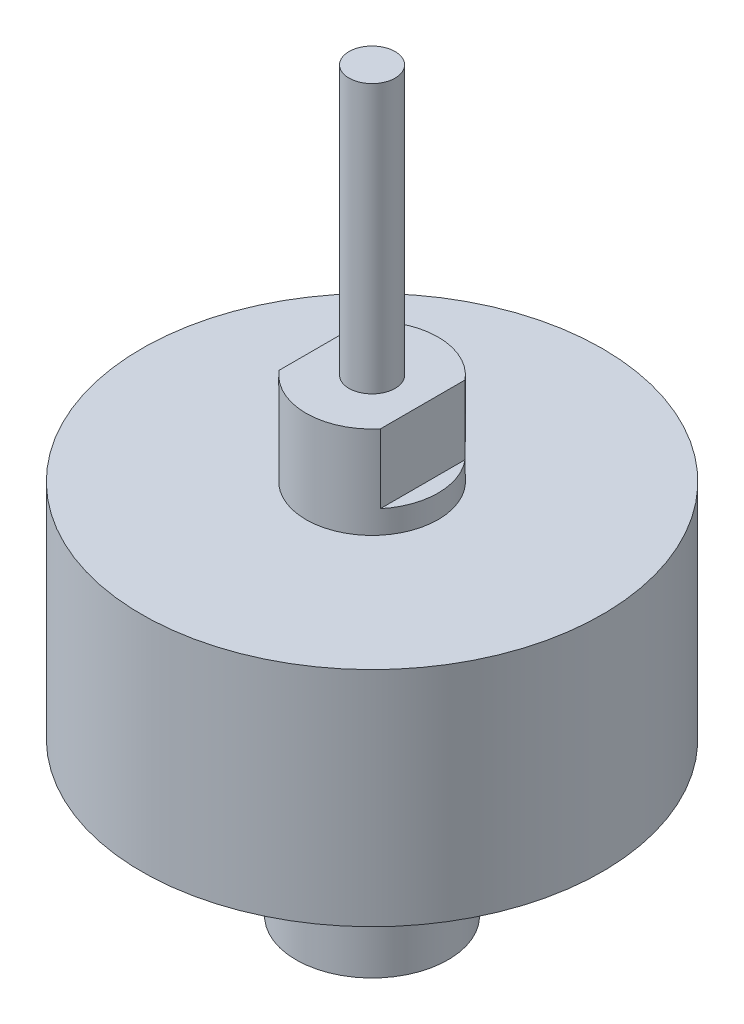
ISO-10303-21;
HEADER;
FILE_DESCRIPTION(('STEP AP214'),'2;1');
FILE_NAME('part.step','',(''),(''),'','','');
FILE_SCHEMA(('AUTOMOTIVE_DESIGN { 1 0 10303 214 1 1 1 1 }'));
ENDSEC;
DATA;
#1=APPLICATION_CONTEXT('core data for automotive mechanical design processes');
#2=APPLICATION_PROTOCOL_DEFINITION('international standard','automotive_design',2000,#1);
#3=PRODUCT_CONTEXT('',#1,'mechanical');
#4=PRODUCT('Part','Part','',(#3));
#5=PRODUCT_RELATED_PRODUCT_CATEGORY('part','',(#4));
#6=PRODUCT_DEFINITION_FORMATION('','',#4);
#7=PRODUCT_DEFINITION_CONTEXT('part definition',#1,'design');
#8=PRODUCT_DEFINITION('design','',#6,#7);
#9=PRODUCT_DEFINITION_SHAPE('','',#8);
#10=(LENGTH_UNIT() NAMED_UNIT(*) SI_UNIT(.MILLI.,.METRE.));
#11=(NAMED_UNIT(*) PLANE_ANGLE_UNIT() SI_UNIT($,.RADIAN.));
#12=(NAMED_UNIT(*) SI_UNIT($,.STERADIAN.) SOLID_ANGLE_UNIT());
#13=UNCERTAINTY_MEASURE_WITH_UNIT(LENGTH_MEASURE(1.E-05),#10,'distance_accuracy_value','');
#14=(GEOMETRIC_REPRESENTATION_CONTEXT(3) GLOBAL_UNCERTAINTY_ASSIGNED_CONTEXT((#13)) GLOBAL_UNIT_ASSIGNED_CONTEXT((#10,
#11,#12)) REPRESENTATION_CONTEXT('',''));
#15=CARTESIAN_POINT('',(0.,0.,0.));
#16=DIRECTION('',(0.,0.,1.));
#17=DIRECTION('',(1.,0.,0.));
#18=AXIS2_PLACEMENT_3D('',#15,#16,#17);
#19=CARTESIAN_POINT('',(0.,26.,0.));
#20=DIRECTION('',(0.,1.,0.));
#21=DIRECTION('',(0.,0.,1.));
#22=AXIS2_PLACEMENT_3D('',#19,#20,#21);
#23=PLANE('',#22);
#24=DIRECTION('',(0.,0.,-1.));
#25=VECTOR('',#24,1.);
#26=CARTESIAN_POINT('',(3.3,26.,-2.75680975041805));
#27=LINE('',#26,#25);
#28=CARTESIAN_POINT('',(3.3,26.,2.75680975041804));
#29=VERTEX_POINT('',#28);
#30=CARTESIAN_POINT('',(3.3,26.,-2.75680975041804));
#31=VERTEX_POINT('',#30);
#32=EDGE_CURVE('E103',#29,#31,#27,.T.);
#33=ORIENTED_EDGE('',*,*,#32,.F.);
#34=CARTESIAN_POINT('',(0.,26.,0.));
#35=DIRECTION('',(0.,1.,0.));
#36=DIRECTION('',(0.,0.,1.));
#37=AXIS2_PLACEMENT_3D('',#34,#35,#36);
#38=CIRCLE('',#37,4.3);
#39=EDGE_CURVE('E64',#29,#31,#38,.T.);
#40=ORIENTED_EDGE('',*,*,#39,.T.);
#41=EDGE_LOOP('',(#33,#40));
#42=FACE_BOUND('',#41,.T.);
#43=ADVANCED_FACE('F41',(#42),#23,.T.);
#44=CARTESIAN_POINT('',(0.,6.,0.));
#45=DIRECTION('',(0.,-1.,0.));
#46=DIRECTION('',(0.,0.,-1.));
#47=AXIS2_PLACEMENT_3D('',#44,#45,#46);
#48=CYLINDRICAL_SURFACE('',#47,4.95);
#49=CARTESIAN_POINT('',(0.,6.,0.));
#50=DIRECTION('',(0.,1.,0.));
#51=DIRECTION('',(0.,0.,1.));
#52=AXIS2_PLACEMENT_3D('',#49,#50,#51);
#53=CIRCLE('',#52,4.95);
#54=CARTESIAN_POINT('',(0.,6.,4.95));
#55=VERTEX_POINT('',#54);
#56=EDGE_CURVE('E117',#55,#55,#53,.T.);
#57=ORIENTED_EDGE('',*,*,#56,.F.);
#58=EDGE_LOOP('',(#57));
#59=FACE_BOUND('',#58,.T.);
#60=CARTESIAN_POINT('',(0.,0.,0.));
#61=DIRECTION('',(0.,1.,0.));
#62=DIRECTION('',(0.,0.,1.));
#63=AXIS2_PLACEMENT_3D('',#60,#61,#62);
#64=CIRCLE('',#63,4.95);
#65=CARTESIAN_POINT('',(0.,0.,4.95));
#66=VERTEX_POINT('',#65);
#67=EDGE_CURVE('E45',#66,#66,#64,.T.);
#68=ORIENTED_EDGE('',*,*,#67,.T.);
#69=EDGE_LOOP('',(#68));
#70=FACE_BOUND('',#69,.T.);
#71=ADVANCED_FACE('F43',(#59,#70),#48,.T.);
#72=CARTESIAN_POINT('',(0.,0.,0.));
#73=DIRECTION('',(0.,1.,0.));
#74=DIRECTION('',(0.,0.,1.));
#75=AXIS2_PLACEMENT_3D('',#72,#73,#74);
#76=PLANE('',#75);
#77=ORIENTED_EDGE('',*,*,#67,.F.);
#78=EDGE_LOOP('',(#77));
#79=FACE_BOUND('',#78,.T.);
#80=ADVANCED_FACE('F135',(#79),#76,.F.);
#81=CARTESIAN_POINT('',(0.,10.,0.));
#82=DIRECTION('',(0.,-1.,0.));
#83=DIRECTION('',(0.,0.,-1.));
#84=AXIS2_PLACEMENT_3D('',#81,#82,#83);
#85=CYLINDRICAL_SURFACE('',#84,5.5);
#86=CARTESIAN_POINT('',(0.,10.,0.));
#87=DIRECTION('',(0.,1.,0.));
#88=DIRECTION('',(0.,0.,1.));
#89=AXIS2_PLACEMENT_3D('',#86,#87,#88);
#90=CIRCLE('',#89,5.5);
#91=CARTESIAN_POINT('',(0.,10.,5.5));
#92=VERTEX_POINT('',#91);
#93=EDGE_CURVE('E124',#92,#92,#90,.T.);
#94=ORIENTED_EDGE('',*,*,#93,.F.);
#95=EDGE_LOOP('',(#94));
#96=FACE_BOUND('',#95,.T.);
#97=CARTESIAN_POINT('',(0.,6.,0.));
#98=DIRECTION('',(0.,1.,0.));
#99=DIRECTION('',(0.,0.,1.));
#100=AXIS2_PLACEMENT_3D('',#97,#98,#99);
#101=CIRCLE('',#100,5.5);
#102=CARTESIAN_POINT('',(0.,6.,5.5));
#103=VERTEX_POINT('',#102);
#104=EDGE_CURVE('E121',#103,#103,#101,.T.);
#105=ORIENTED_EDGE('',*,*,#104,.T.);
#106=EDGE_LOOP('',(#105));
#107=FACE_BOUND('',#106,.T.);
#108=ADVANCED_FACE('F137',(#96,#107),#85,.T.);
#109=CARTESIAN_POINT('',(0.,6.,0.));
#110=DIRECTION('',(0.,1.,0.));
#111=DIRECTION('',(0.,0.,1.));
#112=AXIS2_PLACEMENT_3D('',#109,#110,#111);
#113=PLANE('',#112);
#114=ORIENTED_EDGE('',*,*,#56,.T.);
#115=EDGE_LOOP('',(#114));
#116=FACE_BOUND('',#115,.T.);
#117=ORIENTED_EDGE('',*,*,#104,.F.);
#118=EDGE_LOOP('',(#117));
#119=FACE_BOUND('',#118,.T.);
#120=ADVANCED_FACE('F142',(#116,#119),#113,.F.);
#121=CARTESIAN_POINT('',(0.,24.5,0.));
#122=DIRECTION('',(0.,-1.,0.));
#123=DIRECTION('',(0.,0.,-1.));
#124=AXIS2_PLACEMENT_3D('',#121,#122,#123);
#125=CYLINDRICAL_SURFACE('',#124,15.);
#126=CARTESIAN_POINT('',(0.,24.5,0.));
#127=DIRECTION('',(0.,1.,0.));
#128=DIRECTION('',(0.,0.,1.));
#129=AXIS2_PLACEMENT_3D('',#126,#127,#128);
#130=CIRCLE('',#129,15.);
#131=CARTESIAN_POINT('',(0.,24.5,-15.));
#132=VERTEX_POINT('',#131);
#133=EDGE_CURVE('E118',#132,#132,#130,.T.);
#134=CARTESIAN_POINT('',(0.,10.,0.));
#135=DIRECTION('',(0.,1.,0.));
#136=DIRECTION('',(0.,0.,1.));
#137=AXIS2_PLACEMENT_3D('',#134,#135,#136);
#138=CIRCLE('',#137,15.);
#139=CARTESIAN_POINT('',(0.,10.,-15.));
#140=VERTEX_POINT('',#139);
#141=EDGE_CURVE('E114',#140,#140,#138,.T.);
#142=CARTESIAN_POINT('',(0.,24.5,-15.));
#143=CARTESIAN_POINT('',(0.,24.3489583333333,-15.));
#144=CARTESIAN_POINT('',(0.,24.1979166666667,-15.));
#145=CARTESIAN_POINT('',(0.,23.8958333333333,-15.));
#146=CARTESIAN_POINT('',(0.,23.7447916666667,-15.));
#147=CARTESIAN_POINT('',(0.,23.4427083333333,-15.));
#148=CARTESIAN_POINT('',(0.,23.2916666666667,-15.));
#149=CARTESIAN_POINT('',(0.,22.9895833333333,-15.));
#150=CARTESIAN_POINT('',(0.,22.8385416666667,-15.));
#151=CARTESIAN_POINT('',(0.,22.5364583333333,-15.));
#152=CARTESIAN_POINT('',(0.,22.3854166666667,-15.));
#153=CARTESIAN_POINT('',(0.,22.0833333333333,-15.));
#154=CARTESIAN_POINT('',(0.,21.9322916666667,-15.));
#155=CARTESIAN_POINT('',(0.,21.6302083333333,-15.));
#156=CARTESIAN_POINT('',(0.,21.4791666666667,-15.));
#157=CARTESIAN_POINT('',(0.,21.1770833333333,-15.));
#158=CARTESIAN_POINT('',(0.,21.0260416666667,-15.));
#159=CARTESIAN_POINT('',(0.,20.7239583333333,-15.));
#160=CARTESIAN_POINT('',(0.,20.5729166666667,-15.));
#161=CARTESIAN_POINT('',(0.,20.2708333333333,-15.));
#162=CARTESIAN_POINT('',(0.,20.1197916666667,-15.));
#163=CARTESIAN_POINT('',(0.,19.8177083333333,-15.));
#164=CARTESIAN_POINT('',(0.,19.6666666666667,-15.));
#165=CARTESIAN_POINT('',(0.,19.3645833333333,-15.));
#166=CARTESIAN_POINT('',(0.,19.2135416666667,-15.));
#167=CARTESIAN_POINT('',(0.,18.9114583333333,-15.));
#168=CARTESIAN_POINT('',(0.,18.7604166666667,-15.));
#169=CARTESIAN_POINT('',(0.,18.4583333333333,-15.));
#170=CARTESIAN_POINT('',(0.,18.3072916666667,-15.));
#171=CARTESIAN_POINT('',(0.,18.0052083333333,-15.));
#172=CARTESIAN_POINT('',(0.,17.8541666666667,-15.));
#173=CARTESIAN_POINT('',(0.,17.5520833333333,-15.));
#174=CARTESIAN_POINT('',(0.,17.4010416666667,-15.));
#175=CARTESIAN_POINT('',(0.,17.0989583333333,-15.));
#176=CARTESIAN_POINT('',(0.,16.9479166666667,-15.));
#177=CARTESIAN_POINT('',(0.,16.6458333333333,-15.));
#178=CARTESIAN_POINT('',(0.,16.4947916666667,-15.));
#179=CARTESIAN_POINT('',(0.,16.1927083333333,-15.));
#180=CARTESIAN_POINT('',(0.,16.0416666666667,-15.));
#181=CARTESIAN_POINT('',(0.,15.7395833333333,-15.));
#182=CARTESIAN_POINT('',(0.,15.5885416666667,-15.));
#183=CARTESIAN_POINT('',(0.,15.2864583333333,-15.));
#184=CARTESIAN_POINT('',(0.,15.1354166666667,-15.));
#185=CARTESIAN_POINT('',(0.,14.8333333333333,-15.));
#186=CARTESIAN_POINT('',(0.,14.6822916666667,-15.));
#187=CARTESIAN_POINT('',(0.,14.3802083333333,-15.));
#188=CARTESIAN_POINT('',(0.,14.2291666666667,-15.));
#189=CARTESIAN_POINT('',(0.,13.9270833333333,-15.));
#190=CARTESIAN_POINT('',(0.,13.7760416666667,-15.));
#191=CARTESIAN_POINT('',(0.,13.4739583333333,-15.));
#192=CARTESIAN_POINT('',(0.,13.3229166666667,-15.));
#193=CARTESIAN_POINT('',(0.,13.0208333333333,-15.));
#194=CARTESIAN_POINT('',(0.,12.8697916666667,-15.));
#195=CARTESIAN_POINT('',(0.,12.5677083333333,-15.));
#196=CARTESIAN_POINT('',(0.,12.4166666666667,-15.));
#197=CARTESIAN_POINT('',(0.,12.1145833333333,-15.));
#198=CARTESIAN_POINT('',(0.,11.9635416666667,-15.));
#199=CARTESIAN_POINT('',(0.,11.6614583333333,-15.));
#200=CARTESIAN_POINT('',(0.,11.5104166666667,-15.));
#201=CARTESIAN_POINT('',(0.,11.2083333333333,-15.));
#202=CARTESIAN_POINT('',(0.,11.0572916666667,-15.));
#203=CARTESIAN_POINT('',(0.,10.7552083333333,-15.));
#204=CARTESIAN_POINT('',(0.,10.6041666666667,-15.));
#205=CARTESIAN_POINT('',(0.,10.3020833333333,-15.));
#206=CARTESIAN_POINT('',(0.,10.1510416666667,-15.));
#207=CARTESIAN_POINT('',(0.,10.,-15.));
#208=B_SPLINE_CURVE_WITH_KNOTS('',3,(#142,#143,#144,#145,#146,#147,#148,#149,#150,#151,#152,
#153,#154,#155,#156,#157,#158,#159,#160,#161,#162,#163,#164,#165,#166,#167,#168,#169,#170,#171,
#172,#173,#174,#175,#176,#177,#178,#179,#180,#181,#182,#183,#184,#185,#186,#187,#188,#189,#190,
#191,#192,#193,#194,#195,#196,#197,#198,#199,#200,#201,#202,#203,#204,#205,#206,#207),
.UNSPECIFIED.,.F.,.F.,(4,2,2,2,2,2,2,2,2,2,2,2,2,2,2,2,2,2,2,2,2,2,2,2,2,2,2,2,2,2,2,2,4),(0.,
0.453124999999999,0.906249999999997,1.359375,1.8125,2.265625,2.71875,3.171875,3.625,4.078125,
4.53125,4.984375,5.4375,5.890625,6.34375,6.796875,7.25,7.703125,8.15625,8.609375,9.0625,
9.515625,9.96875,10.421875,10.875,11.328125,11.78125,12.234375,12.6875,13.140625,13.59375,
14.046875,14.5),.UNSPECIFIED.);
#209=EDGE_CURVE('BSEAM168',#132,#140,#208,.T.);
#210=ORIENTED_EDGE('',*,*,#133,.F.);
#211=ORIENTED_EDGE('',*,*,#141,.T.);
#212=ORIENTED_EDGE('',*,*,#209,.T.);
#213=ORIENTED_EDGE('',*,*,#209,.F.);
#214=EDGE_LOOP('',(#210,#212,#211,#213));
#215=FACE_BOUND('',#214,.T.);
#216=ADVANCED_FACE('F168',(#215),#125,.T.);
#217=CARTESIAN_POINT('',(0.,24.5,0.));
#218=DIRECTION('',(0.,1.,0.));
#219=DIRECTION('',(0.,0.,1.));
#220=AXIS2_PLACEMENT_3D('',#217,#218,#219);
#221=PLANE('',#220);
#222=CARTESIAN_POINT('',(0.,24.5,0.));
#223=DIRECTION('',(0.,1.,0.));
#224=DIRECTION('',(0.,0.,1.));
#225=AXIS2_PLACEMENT_3D('',#222,#223,#224);
#226=CIRCLE('',#225,4.3);
#227=CARTESIAN_POINT('',(0.,24.5,4.3));
#228=VERTEX_POINT('',#227);
#229=EDGE_CURVE('E50',#228,#228,#226,.T.);
#230=ORIENTED_EDGE('',*,*,#229,.F.);
#231=EDGE_LOOP('',(#230));
#232=FACE_BOUND('',#231,.T.);
#233=ORIENTED_EDGE('',*,*,#133,.T.);
#234=EDGE_LOOP('',(#233));
#235=FACE_BOUND('',#234,.T.);
#236=ADVANCED_FACE('F164',(#232,#235),#221,.T.);
#237=CARTESIAN_POINT('',(0.,10.,0.));
#238=DIRECTION('',(0.,1.,0.));
#239=DIRECTION('',(0.,0.,1.));
#240=AXIS2_PLACEMENT_3D('',#237,#238,#239);
#241=PLANE('',#240);
#242=ORIENTED_EDGE('',*,*,#93,.T.);
#243=EDGE_LOOP('',(#242));
#244=FACE_BOUND('',#243,.T.);
#245=ORIENTED_EDGE('',*,*,#141,.F.);
#246=EDGE_LOOP('',(#245));
#247=FACE_BOUND('',#246,.T.);
#248=ADVANCED_FACE('F160',(#244,#247),#241,.F.);
#249=CARTESIAN_POINT('',(0.,26.,0.));
#250=DIRECTION('',(0.,-1.,0.));
#251=DIRECTION('',(0.,0.,-1.));
#252=AXIS2_PLACEMENT_3D('',#249,#250,#251);
#253=CYLINDRICAL_SURFACE('',#252,4.3);
#254=ORIENTED_EDGE('',*,*,#39,.F.);
#255=DIRECTION('',(0.,-1.,0.));
#256=VECTOR('',#255,1.);
#257=CARTESIAN_POINT('',(3.3,30.5,2.75680975041805));
#258=LINE('',#257,#256);
#259=CARTESIAN_POINT('',(3.3,30.5,2.75680975041805));
#260=VERTEX_POINT('',#259);
#261=EDGE_CURVE('E110',#260,#29,#258,.T.);
#262=ORIENTED_EDGE('',*,*,#261,.F.);
#263=CARTESIAN_POINT('',(0.,30.5,0.));
#264=DIRECTION('',(0.,1.,0.));
#265=DIRECTION('',(0.,0.,1.));
#266=AXIS2_PLACEMENT_3D('',#263,#264,#265);
#267=CIRCLE('',#266,4.3);
#268=CARTESIAN_POINT('',(-3.3,30.5,2.75680975041805));
#269=VERTEX_POINT('',#268);
#270=EDGE_CURVE('E93',#269,#260,#267,.T.);
#271=ORIENTED_EDGE('',*,*,#270,.F.);
#272=DIRECTION('',(0.,-1.,0.));
#273=VECTOR('',#272,1.);
#274=CARTESIAN_POINT('',(-3.3,30.5,2.75680975041805));
#275=LINE('',#274,#273);
#276=CARTESIAN_POINT('',(-3.3,26.,2.75680975041805));
#277=VERTEX_POINT('',#276);
#278=EDGE_CURVE('E90',#269,#277,#275,.T.);
#279=ORIENTED_EDGE('',*,*,#278,.T.);
#280=CARTESIAN_POINT('',(-3.3,26.,-2.75680975041804));
#281=VERTEX_POINT('',#280);
#282=EDGE_CURVE('E107',#281,#277,#38,.T.);
#283=ORIENTED_EDGE('',*,*,#282,.F.);
#284=DIRECTION('',(0.,-1.,0.));
#285=VECTOR('',#284,1.);
#286=CARTESIAN_POINT('',(-3.3,30.5,-2.75680975041805));
#287=LINE('',#286,#285);
#288=CARTESIAN_POINT('',(-3.3,30.5,-2.75680975041805));
#289=VERTEX_POINT('',#288);
#290=EDGE_CURVE('E88',#289,#281,#287,.T.);
#291=ORIENTED_EDGE('',*,*,#290,.F.);
#292=CARTESIAN_POINT('',(0.,30.5,0.));
#293=DIRECTION('',(0.,1.,0.));
#294=DIRECTION('',(0.,0.,1.));
#295=AXIS2_PLACEMENT_3D('',#292,#293,#294);
#296=CIRCLE('',#295,4.3);
#297=CARTESIAN_POINT('',(3.3,30.5,-2.75680975041805));
#298=VERTEX_POINT('',#297);
#299=EDGE_CURVE('E94',#298,#289,#296,.T.);
#300=ORIENTED_EDGE('',*,*,#299,.F.);
#301=DIRECTION('',(0.,-1.,0.));
#302=VECTOR('',#301,1.);
#303=CARTESIAN_POINT('',(3.3,30.5,-2.75680975041805));
#304=LINE('',#303,#302);
#305=EDGE_CURVE('E268',#298,#31,#304,.T.);
#306=ORIENTED_EDGE('',*,*,#305,.T.);
#307=EDGE_LOOP('',(#254,#262,#271,#279,#283,#291,#300,#306));
#308=FACE_BOUND('',#307,.T.);
#309=ORIENTED_EDGE('',*,*,#229,.T.);
#310=EDGE_LOOP('',(#309));
#311=FACE_BOUND('',#310,.T.);
#312=ADVANCED_FACE('F105',(#308,#311),#253,.T.);
#313=DIRECTION('',(0.,0.,1.));
#314=VECTOR('',#313,1.);
#315=CARTESIAN_POINT('',(-3.3,26.,-2.75680975041805));
#316=LINE('',#315,#314);
#317=EDGE_CURVE('E57',#281,#277,#316,.T.);
#318=ORIENTED_EDGE('',*,*,#317,.F.);
#319=ORIENTED_EDGE('',*,*,#282,.T.);
#320=EDGE_LOOP('',(#318,#319));
#321=FACE_BOUND('',#320,.T.);
#322=ADVANCED_FACE('F148',(#321),#23,.T.);
#323=CARTESIAN_POINT('',(-3.3,30.5,-2.75680975041805));
#324=DIRECTION('',(1.,0.,0.));
#325=DIRECTION('',(0.,0.,-1.));
#326=AXIS2_PLACEMENT_3D('',#323,#324,#325);
#327=PLANE('',#326);
#328=ORIENTED_EDGE('',*,*,#317,.T.);
#329=ORIENTED_EDGE('',*,*,#278,.F.);
#330=DIRECTION('',(0.,0.,1.));
#331=VECTOR('',#330,1.);
#332=CARTESIAN_POINT('',(-3.3,30.5,-2.75680975041805));
#333=LINE('',#332,#331);
#334=EDGE_CURVE('E84',#289,#269,#333,.T.);
#335=ORIENTED_EDGE('',*,*,#334,.F.);
#336=ORIENTED_EDGE('',*,*,#290,.T.);
#337=EDGE_LOOP('',(#328,#329,#335,#336));
#338=FACE_BOUND('',#337,.T.);
#339=ADVANCED_FACE('F86',(#338),#327,.F.);
#340=CARTESIAN_POINT('',(3.3,30.5,-2.75680975041805));
#341=DIRECTION('',(-1.,0.,0.));
#342=DIRECTION('',(0.,0.,1.));
#343=AXIS2_PLACEMENT_3D('',#340,#341,#342);
#344=PLANE('',#343);
#345=ORIENTED_EDGE('',*,*,#32,.T.);
#346=ORIENTED_EDGE('',*,*,#305,.F.);
#347=DIRECTION('',(0.,0.,-1.));
#348=VECTOR('',#347,1.);
#349=CARTESIAN_POINT('',(3.3,30.5,-2.75680975041805));
#350=LINE('',#349,#348);
#351=EDGE_CURVE('E99',#260,#298,#350,.T.);
#352=ORIENTED_EDGE('',*,*,#351,.F.);
#353=ORIENTED_EDGE('',*,*,#261,.T.);
#354=EDGE_LOOP('',(#345,#346,#352,#353));
#355=FACE_BOUND('',#354,.T.);
#356=ADVANCED_FACE('F159',(#355),#344,.F.);
#357=CARTESIAN_POINT('',(0.,30.5,0.));
#358=DIRECTION('',(0.,1.,0.));
#359=DIRECTION('',(0.,0.,1.));
#360=AXIS2_PLACEMENT_3D('',#357,#358,#359);
#361=PLANE('',#360);
#362=CARTESIAN_POINT('',(0.,30.5,0.));
#363=DIRECTION('',(0.,1.,0.));
#364=DIRECTION('',(0.,0.,1.));
#365=AXIS2_PLACEMENT_3D('',#362,#363,#364);
#366=CIRCLE('',#365,1.5);
#367=CARTESIAN_POINT('',(0.,30.5,1.5));
#368=VERTEX_POINT('',#367);
#369=EDGE_CURVE('E11',#368,#368,#366,.T.);
#370=ORIENTED_EDGE('',*,*,#369,.F.);
#371=EDGE_LOOP('',(#370));
#372=FACE_BOUND('',#371,.T.);
#373=ORIENTED_EDGE('',*,*,#299,.T.);
#374=ORIENTED_EDGE('',*,*,#334,.T.);
#375=ORIENTED_EDGE('',*,*,#270,.T.);
#376=ORIENTED_EDGE('',*,*,#351,.T.);
#377=EDGE_LOOP('',(#373,#374,#375,#376));
#378=FACE_BOUND('',#377,.T.);
#379=ADVANCED_FACE('F97',(#372,#378),#361,.T.);
#380=CARTESIAN_POINT('',(0.,48.,0.));
#381=DIRECTION('',(0.,-1.,0.));
#382=DIRECTION('',(0.,0.,-1.));
#383=AXIS2_PLACEMENT_3D('',#380,#381,#382);
#384=CYLINDRICAL_SURFACE('',#383,1.5);
#385=CARTESIAN_POINT('',(0.,48.,0.));
#386=DIRECTION('',(0.,1.,0.));
#387=DIRECTION('',(0.,0.,1.));
#388=AXIS2_PLACEMENT_3D('',#385,#386,#387);
#389=CIRCLE('',#388,1.5);
#390=CARTESIAN_POINT('',(0.,48.,1.5));
#391=VERTEX_POINT('',#390);
#392=EDGE_CURVE('E263',#391,#391,#389,.T.);
#393=ORIENTED_EDGE('',*,*,#392,.F.);
#394=EDGE_LOOP('',(#393));
#395=FACE_BOUND('',#394,.T.);
#396=ORIENTED_EDGE('',*,*,#369,.T.);
#397=EDGE_LOOP('',(#396));
#398=FACE_BOUND('',#397,.T.);
#399=ADVANCED_FACE('F235',(#395,#398),#384,.T.);
#400=CARTESIAN_POINT('',(0.,48.,0.));
#401=DIRECTION('',(0.,1.,0.));
#402=DIRECTION('',(0.,0.,1.));
#403=AXIS2_PLACEMENT_3D('',#400,#401,#402);
#404=PLANE('',#403);
#405=ORIENTED_EDGE('',*,*,#392,.T.);
#406=EDGE_LOOP('',(#405));
#407=FACE_BOUND('',#406,.T.);
#408=ADVANCED_FACE('F244',(#407),#404,.T.);
#409=CLOSED_SHELL('',(#43,#71,#80,#108,#120,#216,#236,#248,#312,#322,#339,#356,#379,#399,#408));
#410=MANIFOLD_SOLID_BREP('B2',#409);
#411=ADVANCED_BREP_SHAPE_REPRESENTATION('',(#18,#410),#14);
#412=SHAPE_DEFINITION_REPRESENTATION(#9,#411);
ENDSEC;
END-ISO-10303-21;
